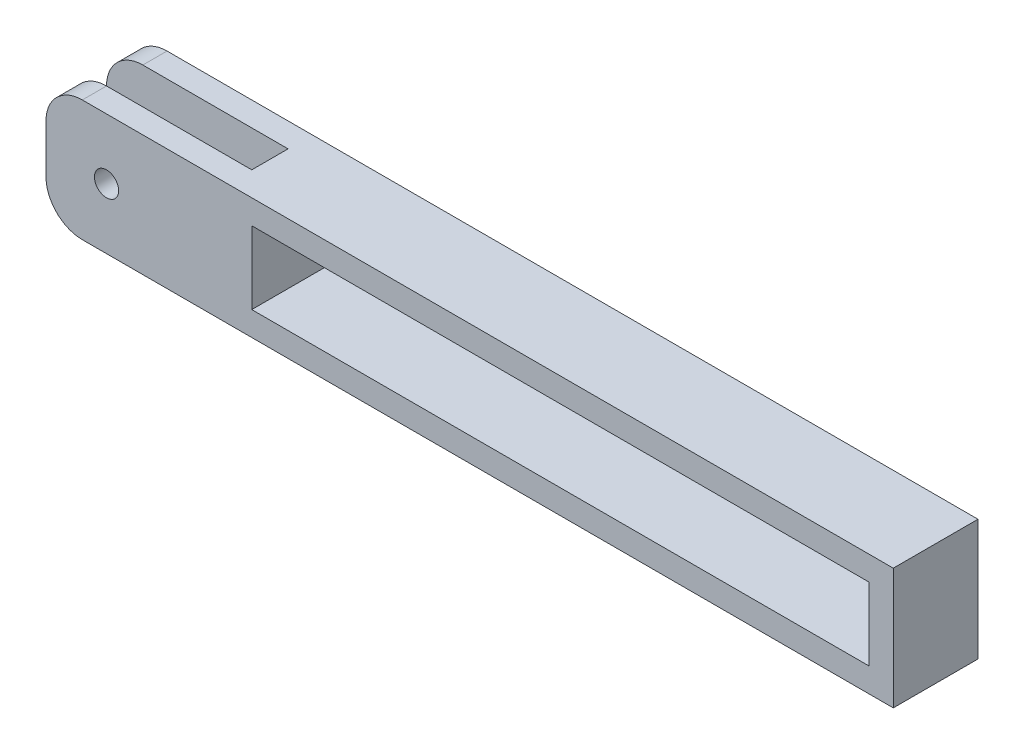
ISO-10303-21;
HEADER;
FILE_DESCRIPTION(('STEP AP214'),'2;1');
FILE_NAME('part.step','',(''),(''),'','','');
FILE_SCHEMA(('AUTOMOTIVE_DESIGN { 1 0 10303 214 1 1 1 1 }'));
ENDSEC;
DATA;
#1=APPLICATION_CONTEXT('core data for automotive mechanical design processes');
#2=APPLICATION_PROTOCOL_DEFINITION('international standard','automotive_design',2000,#1);
#3=PRODUCT_CONTEXT('',#1,'mechanical');
#4=PRODUCT('Part','Part','',(#3));
#5=PRODUCT_RELATED_PRODUCT_CATEGORY('part','',(#4));
#6=PRODUCT_DEFINITION_FORMATION('','',#4);
#7=PRODUCT_DEFINITION_CONTEXT('part definition',#1,'design');
#8=PRODUCT_DEFINITION('design','',#6,#7);
#9=PRODUCT_DEFINITION_SHAPE('','',#8);
#10=(LENGTH_UNIT() NAMED_UNIT(*) SI_UNIT(.MILLI.,.METRE.));
#11=(NAMED_UNIT(*) PLANE_ANGLE_UNIT() SI_UNIT($,.RADIAN.));
#12=(NAMED_UNIT(*) SI_UNIT($,.STERADIAN.) SOLID_ANGLE_UNIT());
#13=UNCERTAINTY_MEASURE_WITH_UNIT(LENGTH_MEASURE(1.E-05),#10,'distance_accuracy_value','');
#14=(GEOMETRIC_REPRESENTATION_CONTEXT(3) GLOBAL_UNCERTAINTY_ASSIGNED_CONTEXT((#13)) GLOBAL_UNIT_ASSIGNED_CONTEXT((#10,
#11,#12)) REPRESENTATION_CONTEXT('',''));
#15=CARTESIAN_POINT('',(0.,0.,0.));
#16=DIRECTION('',(0.,0.,1.));
#17=DIRECTION('',(1.,0.,0.));
#18=AXIS2_PLACEMENT_3D('',#15,#16,#17);
#19=CARTESIAN_POINT('',(-10.,10.,17.5));
#20=DIRECTION('',(0.,0.,-1.));
#21=DIRECTION('',(-1.,0.,0.));
#22=AXIS2_PLACEMENT_3D('',#19,#20,#21);
#23=CYLINDRICAL_SURFACE('',#22,15.);
#24=DIRECTION('',(0.,0.,-1.));
#25=VECTOR('',#24,1.);
#26=CARTESIAN_POINT('',(-25.,10.,17.5));
#27=LINE('',#26,#25);
#28=CARTESIAN_POINT('',(-25.,10.,-7.5));
#29=VERTEX_POINT('',#28);
#30=CARTESIAN_POINT('',(-25.,10.,-17.5));
#31=VERTEX_POINT('',#30);
#32=EDGE_CURVE('E268',#29,#31,#27,.T.);
#33=ORIENTED_EDGE('',*,*,#32,.F.);
#34=CARTESIAN_POINT('',(-10.,10.,-7.5));
#35=DIRECTION('',(0.,0.,-1.));
#36=DIRECTION('',(-1.,0.,0.));
#37=AXIS2_PLACEMENT_3D('',#34,#35,#36);
#38=CIRCLE('',#37,15.);
#39=CARTESIAN_POINT('',(-10.,25.,-7.5));
#40=VERTEX_POINT('',#39);
#41=EDGE_CURVE('E224',#29,#40,#38,.T.);
#42=ORIENTED_EDGE('',*,*,#41,.T.);
#43=DIRECTION('',(0.,0.,-1.));
#44=VECTOR('',#43,1.);
#45=CARTESIAN_POINT('',(-10.,25.,17.5));
#46=LINE('',#45,#44);
#47=CARTESIAN_POINT('',(-10.,25.,-17.5));
#48=VERTEX_POINT('',#47);
#49=EDGE_CURVE('E272',#40,#48,#46,.T.);
#50=ORIENTED_EDGE('',*,*,#49,.T.);
#51=CARTESIAN_POINT('',(-10.,10.,-17.5));
#52=DIRECTION('',(0.,0.,1.));
#53=DIRECTION('',(1.,0.,0.));
#54=AXIS2_PLACEMENT_3D('',#51,#52,#53);
#55=CIRCLE('',#54,15.);
#56=EDGE_CURVE('E248',#48,#31,#55,.T.);
#57=ORIENTED_EDGE('',*,*,#56,.T.);
#58=EDGE_LOOP('',(#33,#42,#50,#57));
#59=FACE_BOUND('',#58,.T.);
#60=ADVANCED_FACE('F33',(#59),#23,.T.);
#61=CARTESIAN_POINT('',(-25.,10.,17.5));
#62=DIRECTION('',(1.,0.,0.));
#63=DIRECTION('',(0.,1.,0.));
#64=AXIS2_PLACEMENT_3D('',#61,#62,#63);
#65=PLANE('',#64);
#66=DIRECTION('',(0.,0.,-1.));
#67=VECTOR('',#66,1.);
#68=CARTESIAN_POINT('',(-25.,-10.,17.5));
#69=LINE('',#68,#67);
#70=CARTESIAN_POINT('',(-25.,-10.,-7.5));
#71=VERTEX_POINT('',#70);
#72=CARTESIAN_POINT('',(-25.,-10.,-17.5));
#73=VERTEX_POINT('',#72);
#74=EDGE_CURVE('E264',#71,#73,#69,.T.);
#75=ORIENTED_EDGE('',*,*,#74,.F.);
#76=DIRECTION('',(0.,1.,0.));
#77=VECTOR('',#76,1.);
#78=CARTESIAN_POINT('',(-25.,-25.,-7.5));
#79=LINE('',#78,#77);
#80=EDGE_CURVE('E206',#71,#29,#79,.T.);
#81=ORIENTED_EDGE('',*,*,#80,.T.);
#82=ORIENTED_EDGE('',*,*,#32,.T.);
#83=DIRECTION('',(0.,-1.,0.));
#84=VECTOR('',#83,1.);
#85=CARTESIAN_POINT('',(-25.,10.,-17.5));
#86=LINE('',#85,#84);
#87=EDGE_CURVE('E251',#31,#73,#86,.T.);
#88=ORIENTED_EDGE('',*,*,#87,.T.);
#89=EDGE_LOOP('',(#75,#81,#82,#88));
#90=FACE_BOUND('',#89,.T.);
#91=ADVANCED_FACE('F327',(#90),#65,.F.);
#92=CARTESIAN_POINT('',(-10.,-10.,17.5));
#93=DIRECTION('',(0.,0.,-1.));
#94=DIRECTION('',(-1.,0.,0.));
#95=AXIS2_PLACEMENT_3D('',#92,#93,#94);
#96=CYLINDRICAL_SURFACE('',#95,15.);
#97=DIRECTION('',(0.,0.,-1.));
#98=VECTOR('',#97,1.);
#99=CARTESIAN_POINT('',(-10.,-25.,17.5));
#100=LINE('',#99,#98);
#101=CARTESIAN_POINT('',(-10.,-25.,-7.5));
#102=VERTEX_POINT('',#101);
#103=CARTESIAN_POINT('',(-10.,-25.,-17.5));
#104=VERTEX_POINT('',#103);
#105=EDGE_CURVE('E260',#102,#104,#100,.T.);
#106=ORIENTED_EDGE('',*,*,#105,.F.);
#107=CARTESIAN_POINT('',(-10.,-10.,-7.5));
#108=DIRECTION('',(0.,0.,-1.));
#109=DIRECTION('',(-1.,0.,0.));
#110=AXIS2_PLACEMENT_3D('',#107,#108,#109);
#111=CIRCLE('',#110,15.);
#112=EDGE_CURVE('E221',#102,#71,#111,.T.);
#113=ORIENTED_EDGE('',*,*,#112,.T.);
#114=ORIENTED_EDGE('',*,*,#74,.T.);
#115=CARTESIAN_POINT('',(-10.,-10.,-17.5));
#116=DIRECTION('',(0.,0.,1.));
#117=DIRECTION('',(-1.,0.,0.));
#118=AXIS2_PLACEMENT_3D('',#115,#116,#117);
#119=CIRCLE('',#118,15.);
#120=EDGE_CURVE('E254',#73,#104,#119,.T.);
#121=ORIENTED_EDGE('',*,*,#120,.T.);
#122=EDGE_LOOP('',(#106,#113,#114,#121));
#123=FACE_BOUND('',#122,.T.);
#124=ADVANCED_FACE('F324',(#123),#96,.T.);
#125=CARTESIAN_POINT('',(325.,25.,17.5));
#126=DIRECTION('',(-1.,0.,0.));
#127=DIRECTION('',(0.,0.,1.));
#128=AXIS2_PLACEMENT_3D('',#125,#126,#127);
#129=PLANE('',#128);
#130=DIRECTION('',(0.,1.,0.));
#131=VECTOR('',#130,1.);
#132=CARTESIAN_POINT('',(325.,25.,-17.5));
#133=LINE('',#132,#131);
#134=CARTESIAN_POINT('',(325.,-25.,-17.5));
#135=VERTEX_POINT('',#134);
#136=CARTESIAN_POINT('',(325.,25.,-17.5));
#137=VERTEX_POINT('',#136);
#138=EDGE_CURVE('E227',#135,#137,#133,.T.);
#139=ORIENTED_EDGE('',*,*,#138,.T.);
#140=DIRECTION('',(0.,0.,-1.));
#141=VECTOR('',#140,1.);
#142=CARTESIAN_POINT('',(325.,25.,17.5));
#143=LINE('',#142,#141);
#144=CARTESIAN_POINT('',(325.,25.,17.5));
#145=VERTEX_POINT('',#144);
#146=EDGE_CURVE('E42',#145,#137,#143,.T.);
#147=ORIENTED_EDGE('',*,*,#146,.F.);
#148=DIRECTION('',(0.,1.,0.));
#149=VECTOR('',#148,1.);
#150=CARTESIAN_POINT('',(325.,25.,17.5));
#151=LINE('',#150,#149);
#152=CARTESIAN_POINT('',(325.,-25.,17.5));
#153=VERTEX_POINT('',#152);
#154=EDGE_CURVE('E228',#153,#145,#151,.T.);
#155=ORIENTED_EDGE('',*,*,#154,.F.);
#156=DIRECTION('',(0.,0.,-1.));
#157=VECTOR('',#156,1.);
#158=CARTESIAN_POINT('',(325.,-25.,17.5));
#159=LINE('',#158,#157);
#160=EDGE_CURVE('E242',#153,#135,#159,.T.);
#161=ORIENTED_EDGE('',*,*,#160,.T.);
#162=EDGE_LOOP('',(#139,#147,#155,#161));
#163=FACE_BOUND('',#162,.T.);
#164=ADVANCED_FACE('F35',(#163),#129,.F.);
#165=CARTESIAN_POINT('',(-10.,25.,17.5));
#166=DIRECTION('',(0.,-1.,0.));
#167=DIRECTION('',(1.,0.,0.));
#168=AXIS2_PLACEMENT_3D('',#165,#166,#167);
#169=PLANE('',#168);
#170=ORIENTED_EDGE('',*,*,#49,.F.);
#171=DIRECTION('',(-1.,0.,0.));
#172=VECTOR('',#171,1.);
#173=CARTESIAN_POINT('',(-25.,25.,-7.5));
#174=LINE('',#173,#172);
#175=CARTESIAN_POINT('',(50.,25.,-7.49999999999999));
#176=VERTEX_POINT('',#175);
#177=EDGE_CURVE('E197',#176,#40,#174,.T.);
#178=ORIENTED_EDGE('',*,*,#177,.F.);
#179=DIRECTION('',(0.,0.,-1.));
#180=VECTOR('',#179,1.);
#181=CARTESIAN_POINT('',(50.,25.,-7.49999999999999));
#182=LINE('',#181,#180);
#183=CARTESIAN_POINT('',(50.,25.,7.49999999999999));
#184=VERTEX_POINT('',#183);
#185=EDGE_CURVE('E202',#184,#176,#182,.T.);
#186=ORIENTED_EDGE('',*,*,#185,.F.);
#187=DIRECTION('',(1.,0.,0.));
#188=VECTOR('',#187,1.);
#189=CARTESIAN_POINT('',(-25.,25.,7.5));
#190=LINE('',#189,#188);
#191=CARTESIAN_POINT('',(-10.,25.,7.5));
#192=VERTEX_POINT('',#191);
#193=EDGE_CURVE('E192',#192,#184,#190,.T.);
#194=ORIENTED_EDGE('',*,*,#193,.F.);
#195=CARTESIAN_POINT('',(-10.,25.,17.5));
#196=VERTEX_POINT('',#195);
#197=EDGE_CURVE('E273',#196,#192,#46,.T.);
#198=ORIENTED_EDGE('',*,*,#197,.F.);
#199=DIRECTION('',(-1.,0.,0.));
#200=VECTOR('',#199,1.);
#201=CARTESIAN_POINT('',(-10.,25.,17.5));
#202=LINE('',#201,#200);
#203=EDGE_CURVE('E231',#145,#196,#202,.T.);
#204=ORIENTED_EDGE('',*,*,#203,.F.);
#205=ORIENTED_EDGE('',*,*,#146,.T.);
#206=DIRECTION('',(-1.,0.,0.));
#207=VECTOR('',#206,1.);
#208=CARTESIAN_POINT('',(-10.,25.,-17.5));
#209=LINE('',#208,#207);
#210=EDGE_CURVE('E245',#137,#48,#209,.T.);
#211=ORIENTED_EDGE('',*,*,#210,.T.);
#212=EDGE_LOOP('',(#170,#178,#186,#194,#198,#204,#205,#211));
#213=FACE_BOUND('',#212,.T.);
#214=ADVANCED_FACE('F280',(#213),#169,.F.);
#215=ORIENTED_EDGE('',*,*,#197,.T.);
#216=CARTESIAN_POINT('',(-10.,10.,7.5));
#217=DIRECTION('',(0.,0.,1.));
#218=DIRECTION('',(1.,0.,0.));
#219=AXIS2_PLACEMENT_3D('',#216,#217,#218);
#220=CIRCLE('',#219,15.);
#221=CARTESIAN_POINT('',(-25.,10.,7.5));
#222=VERTEX_POINT('',#221);
#223=EDGE_CURVE('E218',#192,#222,#220,.T.);
#224=ORIENTED_EDGE('',*,*,#223,.T.);
#225=CARTESIAN_POINT('',(-25.,10.,17.5));
#226=VERTEX_POINT('',#225);
#227=EDGE_CURVE('E269',#226,#222,#27,.T.);
#228=ORIENTED_EDGE('',*,*,#227,.F.);
#229=CARTESIAN_POINT('',(-10.,10.,17.5));
#230=DIRECTION('',(0.,0.,1.));
#231=DIRECTION('',(1.,0.,0.));
#232=AXIS2_PLACEMENT_3D('',#229,#230,#231);
#233=CIRCLE('',#232,15.);
#234=EDGE_CURVE('E234',#196,#226,#233,.T.);
#235=ORIENTED_EDGE('',*,*,#234,.F.);
#236=EDGE_LOOP('',(#215,#224,#228,#235));
#237=FACE_BOUND('',#236,.T.);
#238=ADVANCED_FACE('F320',(#237),#23,.T.);
#239=ORIENTED_EDGE('',*,*,#227,.T.);
#240=DIRECTION('',(0.,1.,0.));
#241=VECTOR('',#240,1.);
#242=CARTESIAN_POINT('',(-25.,-25.,7.5));
#243=LINE('',#242,#241);
#244=CARTESIAN_POINT('',(-25.,-10.,7.5));
#245=VERTEX_POINT('',#244);
#246=EDGE_CURVE('E200',#245,#222,#243,.T.);
#247=ORIENTED_EDGE('',*,*,#246,.F.);
#248=CARTESIAN_POINT('',(-25.,-10.,17.5));
#249=VERTEX_POINT('',#248);
#250=EDGE_CURVE('E265',#249,#245,#69,.T.);
#251=ORIENTED_EDGE('',*,*,#250,.F.);
#252=DIRECTION('',(0.,-1.,0.));
#253=VECTOR('',#252,1.);
#254=CARTESIAN_POINT('',(-25.,10.,17.5));
#255=LINE('',#254,#253);
#256=EDGE_CURVE('E236',#226,#249,#255,.T.);
#257=ORIENTED_EDGE('',*,*,#256,.F.);
#258=EDGE_LOOP('',(#239,#247,#251,#257));
#259=FACE_BOUND('',#258,.T.);
#260=ADVANCED_FACE('F315',(#259),#65,.F.);
#261=ORIENTED_EDGE('',*,*,#250,.T.);
#262=CARTESIAN_POINT('',(-10.,-10.,7.5));
#263=DIRECTION('',(0.,0.,1.));
#264=DIRECTION('',(1.,0.,0.));
#265=AXIS2_PLACEMENT_3D('',#262,#263,#264);
#266=CIRCLE('',#265,15.);
#267=CARTESIAN_POINT('',(-10.,-25.,7.5));
#268=VERTEX_POINT('',#267);
#269=EDGE_CURVE('E209',#245,#268,#266,.T.);
#270=ORIENTED_EDGE('',*,*,#269,.T.);
#271=CARTESIAN_POINT('',(-10.,-25.,17.5));
#272=VERTEX_POINT('',#271);
#273=EDGE_CURVE('E261',#272,#268,#100,.T.);
#274=ORIENTED_EDGE('',*,*,#273,.F.);
#275=CARTESIAN_POINT('',(-10.,-10.,17.5));
#276=DIRECTION('',(0.,0.,1.));
#277=DIRECTION('',(-1.,0.,0.));
#278=AXIS2_PLACEMENT_3D('',#275,#276,#277);
#279=CIRCLE('',#278,15.);
#280=EDGE_CURVE('E238',#249,#272,#279,.T.);
#281=ORIENTED_EDGE('',*,*,#280,.F.);
#282=EDGE_LOOP('',(#261,#270,#274,#281));
#283=FACE_BOUND('',#282,.T.);
#284=ADVANCED_FACE('F311',(#283),#96,.T.);
#285=CARTESIAN_POINT('',(-10.,-25.,17.5));
#286=DIRECTION('',(0.,1.,0.));
#287=DIRECTION('',(-1.,0.,0.));
#288=AXIS2_PLACEMENT_3D('',#285,#286,#287);
#289=PLANE('',#288);
#290=DIRECTION('',(0.,0.,-1.));
#291=VECTOR('',#290,1.);
#292=CARTESIAN_POINT('',(50.,-25.,-7.49999999999999));
#293=LINE('',#292,#291);
#294=CARTESIAN_POINT('',(50.,-25.,7.49999999999999));
#295=VERTEX_POINT('',#294);
#296=CARTESIAN_POINT('',(50.,-25.,-7.49999999999999));
#297=VERTEX_POINT('',#296);
#298=EDGE_CURVE('E193',#295,#297,#293,.T.);
#299=ORIENTED_EDGE('',*,*,#298,.T.);
#300=DIRECTION('',(-1.,0.,0.));
#301=VECTOR('',#300,1.);
#302=CARTESIAN_POINT('',(-25.,-25.,-7.5));
#303=LINE('',#302,#301);
#304=EDGE_CURVE('E196',#297,#102,#303,.T.);
#305=ORIENTED_EDGE('',*,*,#304,.T.);
#306=ORIENTED_EDGE('',*,*,#105,.T.);
#307=DIRECTION('',(1.,0.,0.));
#308=VECTOR('',#307,1.);
#309=CARTESIAN_POINT('',(-10.,-25.,-17.5));
#310=LINE('',#309,#308);
#311=EDGE_CURVE('E232',#104,#135,#310,.T.);
#312=ORIENTED_EDGE('',*,*,#311,.T.);
#313=ORIENTED_EDGE('',*,*,#160,.F.);
#314=DIRECTION('',(1.,0.,0.));
#315=VECTOR('',#314,1.);
#316=CARTESIAN_POINT('',(-10.,-25.,17.5));
#317=LINE('',#316,#315);
#318=EDGE_CURVE('E240',#272,#153,#317,.T.);
#319=ORIENTED_EDGE('',*,*,#318,.F.);
#320=ORIENTED_EDGE('',*,*,#273,.T.);
#321=DIRECTION('',(1.,0.,0.));
#322=VECTOR('',#321,1.);
#323=CARTESIAN_POINT('',(-10.,-25.,7.5));
#324=LINE('',#323,#322);
#325=EDGE_CURVE('E12',#268,#295,#324,.T.);
#326=ORIENTED_EDGE('',*,*,#325,.T.);
#327=EDGE_LOOP('',(#299,#305,#306,#312,#313,#319,#320,#326));
#328=FACE_BOUND('',#327,.T.);
#329=ADVANCED_FACE('F306',(#328),#289,.F.);
#330=CARTESIAN_POINT('',(-10.,-10.,17.5));
#331=DIRECTION('',(0.,0.,-1.));
#332=DIRECTION('',(-1.,0.,0.));
#333=AXIS2_PLACEMENT_3D('',#330,#331,#332);
#334=PLANE('',#333);
#335=DIRECTION('',(0.,-1.,0.));
#336=VECTOR('',#335,1.);
#337=CARTESIAN_POINT('',(60.,-15.,17.5));
#338=LINE('',#337,#336);
#339=CARTESIAN_POINT('',(60.,15.,17.5));
#340=VERTEX_POINT('',#339);
#341=CARTESIAN_POINT('',(60.,-15.,17.5));
#342=VERTEX_POINT('',#341);
#343=EDGE_CURVE('E158',#340,#342,#338,.T.);
#344=ORIENTED_EDGE('',*,*,#343,.F.);
#345=DIRECTION('',(-1.,0.,0.));
#346=VECTOR('',#345,1.);
#347=CARTESIAN_POINT('',(315.,15.,17.5));
#348=LINE('',#347,#346);
#349=CARTESIAN_POINT('',(315.,15.,17.5));
#350=VERTEX_POINT('',#349);
#351=EDGE_CURVE('E49',#350,#340,#348,.T.);
#352=ORIENTED_EDGE('',*,*,#351,.F.);
#353=DIRECTION('',(0.,1.,0.));
#354=VECTOR('',#353,1.);
#355=CARTESIAN_POINT('',(315.,-15.,17.5));
#356=LINE('',#355,#354);
#357=CARTESIAN_POINT('',(315.,-15.,17.5));
#358=VERTEX_POINT('',#357);
#359=EDGE_CURVE('E165',#358,#350,#356,.T.);
#360=ORIENTED_EDGE('',*,*,#359,.F.);
#361=DIRECTION('',(1.,0.,0.));
#362=VECTOR('',#361,1.);
#363=CARTESIAN_POINT('',(60.,-15.,17.5));
#364=LINE('',#363,#362);
#365=EDGE_CURVE('E149',#342,#358,#364,.T.);
#366=ORIENTED_EDGE('',*,*,#365,.F.);
#367=EDGE_LOOP('',(#344,#352,#360,#366));
#368=FACE_BOUND('',#367,.T.);
#369=CARTESIAN_POINT('',(0.,0.,17.5));
#370=DIRECTION('',(0.,0.,1.));
#371=DIRECTION('',(1.,0.,0.));
#372=AXIS2_PLACEMENT_3D('',#369,#370,#371);
#373=CIRCLE('',#372,5.);
#374=CARTESIAN_POINT('',(5.,0.,17.5));
#375=VERTEX_POINT('',#374);
#376=EDGE_CURVE('E181',#375,#375,#373,.T.);
#377=ORIENTED_EDGE('',*,*,#376,.F.);
#378=EDGE_LOOP('',(#377));
#379=FACE_BOUND('',#378,.T.);
#380=ORIENTED_EDGE('',*,*,#154,.T.);
#381=ORIENTED_EDGE('',*,*,#203,.T.);
#382=ORIENTED_EDGE('',*,*,#234,.T.);
#383=ORIENTED_EDGE('',*,*,#256,.T.);
#384=ORIENTED_EDGE('',*,*,#280,.T.);
#385=ORIENTED_EDGE('',*,*,#318,.T.);
#386=EDGE_LOOP('',(#380,#381,#382,#383,#384,#385));
#387=FACE_BOUND('',#386,.T.);
#388=ADVANCED_FACE('F162',(#368,#379,#387),#334,.F.);
#389=CARTESIAN_POINT('',(-10.,-10.,-17.5));
#390=DIRECTION('',(0.,0.,-1.));
#391=DIRECTION('',(-1.,0.,0.));
#392=AXIS2_PLACEMENT_3D('',#389,#390,#391);
#393=PLANE('',#392);
#394=DIRECTION('',(-1.,0.,0.));
#395=VECTOR('',#394,1.);
#396=CARTESIAN_POINT('',(315.,15.,-17.5));
#397=LINE('',#396,#395);
#398=CARTESIAN_POINT('',(315.,15.,-17.5));
#399=VERTEX_POINT('',#398);
#400=CARTESIAN_POINT('',(60.,15.,-17.5));
#401=VERTEX_POINT('',#400);
#402=EDGE_CURVE('E167',#399,#401,#397,.T.);
#403=ORIENTED_EDGE('',*,*,#402,.T.);
#404=DIRECTION('',(0.,-1.,0.));
#405=VECTOR('',#404,1.);
#406=CARTESIAN_POINT('',(60.,-15.,-17.5));
#407=LINE('',#406,#405);
#408=CARTESIAN_POINT('',(60.,-15.,-17.5));
#409=VERTEX_POINT('',#408);
#410=EDGE_CURVE('E173',#401,#409,#407,.T.);
#411=ORIENTED_EDGE('',*,*,#410,.T.);
#412=DIRECTION('',(1.,0.,0.));
#413=VECTOR('',#412,1.);
#414=CARTESIAN_POINT('',(60.,-15.,-17.5));
#415=LINE('',#414,#413);
#416=CARTESIAN_POINT('',(315.,-15.,-17.5));
#417=VERTEX_POINT('',#416);
#418=EDGE_CURVE('E57',#409,#417,#415,.T.);
#419=ORIENTED_EDGE('',*,*,#418,.T.);
#420=DIRECTION('',(0.,1.,0.));
#421=VECTOR('',#420,1.);
#422=CARTESIAN_POINT('',(315.,-15.,-17.5));
#423=LINE('',#422,#421);
#424=EDGE_CURVE('E176',#417,#399,#423,.T.);
#425=ORIENTED_EDGE('',*,*,#424,.T.);
#426=EDGE_LOOP('',(#403,#411,#419,#425));
#427=FACE_BOUND('',#426,.T.);
#428=CARTESIAN_POINT('',(0.,0.,-17.5));
#429=DIRECTION('',(0.,0.,1.));
#430=DIRECTION('',(1.,0.,0.));
#431=AXIS2_PLACEMENT_3D('',#428,#429,#430);
#432=CIRCLE('',#431,5.);
#433=CARTESIAN_POINT('',(5.,0.,-17.5));
#434=VERTEX_POINT('',#433);
#435=EDGE_CURVE('E186',#434,#434,#432,.T.);
#436=ORIENTED_EDGE('',*,*,#435,.T.);
#437=EDGE_LOOP('',(#436));
#438=FACE_BOUND('',#437,.T.);
#439=ORIENTED_EDGE('',*,*,#138,.F.);
#440=ORIENTED_EDGE('',*,*,#311,.F.);
#441=ORIENTED_EDGE('',*,*,#120,.F.);
#442=ORIENTED_EDGE('',*,*,#87,.F.);
#443=ORIENTED_EDGE('',*,*,#56,.F.);
#444=ORIENTED_EDGE('',*,*,#210,.F.);
#445=EDGE_LOOP('',(#439,#440,#441,#442,#443,#444));
#446=FACE_BOUND('',#445,.T.);
#447=ADVANCED_FACE('F289',(#427,#438,#446),#393,.T.);
#448=CARTESIAN_POINT('',(-25.,-25.,-7.5));
#449=DIRECTION('',(0.,0.,-1.));
#450=DIRECTION('',(-1.,0.,0.));
#451=AXIS2_PLACEMENT_3D('',#448,#449,#450);
#452=PLANE('',#451);
#453=CARTESIAN_POINT('',(0.,0.,-7.5));
#454=DIRECTION('',(0.,0.,-1.));
#455=DIRECTION('',(-1.,0.,0.));
#456=AXIS2_PLACEMENT_3D('',#453,#454,#455);
#457=CIRCLE('',#456,5.);
#458=CARTESIAN_POINT('',(-5.,0.,-7.5));
#459=VERTEX_POINT('',#458);
#460=EDGE_CURVE('E189',#459,#459,#457,.T.);
#461=ORIENTED_EDGE('',*,*,#460,.T.);
#462=EDGE_LOOP('',(#461));
#463=FACE_BOUND('',#462,.T.);
#464=ORIENTED_EDGE('',*,*,#80,.F.);
#465=ORIENTED_EDGE('',*,*,#112,.F.);
#466=ORIENTED_EDGE('',*,*,#304,.F.);
#467=DIRECTION('',(0.,1.,0.));
#468=VECTOR('',#467,1.);
#469=CARTESIAN_POINT('',(50.,-25.,-7.49999999999999));
#470=LINE('',#469,#468);
#471=EDGE_CURVE('E210',#297,#176,#470,.T.);
#472=ORIENTED_EDGE('',*,*,#471,.T.);
#473=ORIENTED_EDGE('',*,*,#177,.T.);
#474=ORIENTED_EDGE('',*,*,#41,.F.);
#475=EDGE_LOOP('',(#464,#465,#466,#472,#473,#474));
#476=FACE_BOUND('',#475,.T.);
#477=ADVANCED_FACE('F298',(#463,#476),#452,.F.);
#478=CARTESIAN_POINT('',(-25.,-25.,7.5));
#479=DIRECTION('',(0.,0.,1.));
#480=DIRECTION('',(1.,0.,0.));
#481=AXIS2_PLACEMENT_3D('',#478,#479,#480);
#482=PLANE('',#481);
#483=CARTESIAN_POINT('',(0.,0.,7.5));
#484=DIRECTION('',(0.,0.,1.));
#485=DIRECTION('',(1.,0.,0.));
#486=AXIS2_PLACEMENT_3D('',#483,#484,#485);
#487=CIRCLE('',#486,5.);
#488=CARTESIAN_POINT('',(5.,0.,7.5));
#489=VERTEX_POINT('',#488);
#490=EDGE_CURVE('E37',#489,#489,#487,.T.);
#491=ORIENTED_EDGE('',*,*,#490,.T.);
#492=EDGE_LOOP('',(#491));
#493=FACE_BOUND('',#492,.T.);
#494=ORIENTED_EDGE('',*,*,#193,.T.);
#495=DIRECTION('',(0.,1.,0.));
#496=VECTOR('',#495,1.);
#497=CARTESIAN_POINT('',(50.,-25.,7.49999999999999));
#498=LINE('',#497,#496);
#499=EDGE_CURVE('E212',#295,#184,#498,.T.);
#500=ORIENTED_EDGE('',*,*,#499,.F.);
#501=ORIENTED_EDGE('',*,*,#325,.F.);
#502=ORIENTED_EDGE('',*,*,#269,.F.);
#503=ORIENTED_EDGE('',*,*,#246,.T.);
#504=ORIENTED_EDGE('',*,*,#223,.F.);
#505=EDGE_LOOP('',(#494,#500,#501,#502,#503,#504));
#506=FACE_BOUND('',#505,.T.);
#507=ADVANCED_FACE('F304',(#493,#506),#482,.F.);
#508=CARTESIAN_POINT('',(50.,-25.,-7.49999999999999));
#509=DIRECTION('',(1.,0.,0.));
#510=DIRECTION('',(0.,0.,-1.));
#511=AXIS2_PLACEMENT_3D('',#508,#509,#510);
#512=PLANE('',#511);
#513=ORIENTED_EDGE('',*,*,#185,.T.);
#514=ORIENTED_EDGE('',*,*,#471,.F.);
#515=ORIENTED_EDGE('',*,*,#298,.F.);
#516=ORIENTED_EDGE('',*,*,#499,.T.);
#517=EDGE_LOOP('',(#513,#514,#515,#516));
#518=FACE_BOUND('',#517,.T.);
#519=ADVANCED_FACE('F301',(#518),#512,.F.);
#520=CARTESIAN_POINT('',(0.,0.,-17.5));
#521=DIRECTION('',(0.,0.,1.));
#522=DIRECTION('',(1.,0.,0.));
#523=AXIS2_PLACEMENT_3D('',#520,#521,#522);
#524=CYLINDRICAL_SURFACE('',#523,5.);
#525=ORIENTED_EDGE('',*,*,#376,.T.);
#526=EDGE_LOOP('',(#525));
#527=FACE_BOUND('',#526,.T.);
#528=ORIENTED_EDGE('',*,*,#490,.F.);
#529=EDGE_LOOP('',(#528));
#530=FACE_BOUND('',#529,.T.);
#531=ADVANCED_FACE('F394',(#527,#530),#524,.F.);
#532=ORIENTED_EDGE('',*,*,#435,.F.);
#533=EDGE_LOOP('',(#532));
#534=FACE_BOUND('',#533,.T.);
#535=ORIENTED_EDGE('',*,*,#460,.F.);
#536=EDGE_LOOP('',(#535));
#537=FACE_BOUND('',#536,.T.);
#538=ADVANCED_FACE('F423',(#534,#537),#524,.F.);
#539=CARTESIAN_POINT('',(315.,15.,-17.5));
#540=DIRECTION('',(0.,1.,0.));
#541=DIRECTION('',(0.,0.,1.));
#542=AXIS2_PLACEMENT_3D('',#539,#540,#541);
#543=PLANE('',#542);
#544=DIRECTION('',(0.,0.,1.));
#545=VECTOR('',#544,1.);
#546=CARTESIAN_POINT('',(60.,15.,-17.5));
#547=LINE('',#546,#545);
#548=EDGE_CURVE('E155',#401,#340,#547,.T.);
#549=ORIENTED_EDGE('',*,*,#548,.F.);
#550=ORIENTED_EDGE('',*,*,#402,.F.);
#551=DIRECTION('',(0.,0.,1.));
#552=VECTOR('',#551,1.);
#553=CARTESIAN_POINT('',(315.,15.,-17.5));
#554=LINE('',#553,#552);
#555=EDGE_CURVE('E179',#399,#350,#554,.T.);
#556=ORIENTED_EDGE('',*,*,#555,.T.);
#557=ORIENTED_EDGE('',*,*,#351,.T.);
#558=EDGE_LOOP('',(#549,#550,#556,#557));
#559=FACE_BOUND('',#558,.T.);
#560=ADVANCED_FACE('F433',(#559),#543,.F.);
#561=CARTESIAN_POINT('',(315.,-15.,-17.5));
#562=DIRECTION('',(1.,0.,0.));
#563=DIRECTION('',(0.,0.,-1.));
#564=AXIS2_PLACEMENT_3D('',#561,#562,#563);
#565=PLANE('',#564);
#566=ORIENTED_EDGE('',*,*,#555,.F.);
#567=ORIENTED_EDGE('',*,*,#424,.F.);
#568=DIRECTION('',(0.,0.,1.));
#569=VECTOR('',#568,1.);
#570=CARTESIAN_POINT('',(315.,-15.,-17.5));
#571=LINE('',#570,#569);
#572=EDGE_CURVE('E154',#417,#358,#571,.T.);
#573=ORIENTED_EDGE('',*,*,#572,.T.);
#574=ORIENTED_EDGE('',*,*,#359,.T.);
#575=EDGE_LOOP('',(#566,#567,#573,#574));
#576=FACE_BOUND('',#575,.T.);
#577=ADVANCED_FACE('F455',(#576),#565,.F.);
#578=CARTESIAN_POINT('',(60.,-15.,-17.5));
#579=DIRECTION('',(0.,-1.,0.));
#580=DIRECTION('',(1.,0.,0.));
#581=AXIS2_PLACEMENT_3D('',#578,#579,#580);
#582=PLANE('',#581);
#583=ORIENTED_EDGE('',*,*,#572,.F.);
#584=ORIENTED_EDGE('',*,*,#418,.F.);
#585=DIRECTION('',(0.,0.,1.));
#586=VECTOR('',#585,1.);
#587=CARTESIAN_POINT('',(60.,-15.,-17.5));
#588=LINE('',#587,#586);
#589=EDGE_CURVE('E145',#409,#342,#588,.T.);
#590=ORIENTED_EDGE('',*,*,#589,.T.);
#591=ORIENTED_EDGE('',*,*,#365,.T.);
#592=EDGE_LOOP('',(#583,#584,#590,#591));
#593=FACE_BOUND('',#592,.T.);
#594=ADVANCED_FACE('F147',(#593),#582,.F.);
#595=CARTESIAN_POINT('',(60.,-15.,-17.5));
#596=DIRECTION('',(-1.,0.,0.));
#597=DIRECTION('',(0.,-1.,0.));
#598=AXIS2_PLACEMENT_3D('',#595,#596,#597);
#599=PLANE('',#598);
#600=ORIENTED_EDGE('',*,*,#589,.F.);
#601=ORIENTED_EDGE('',*,*,#410,.F.);
#602=ORIENTED_EDGE('',*,*,#548,.T.);
#603=ORIENTED_EDGE('',*,*,#343,.T.);
#604=EDGE_LOOP('',(#600,#601,#602,#603));
#605=FACE_BOUND('',#604,.T.);
#606=ADVANCED_FACE('F159',(#605),#599,.F.);
#607=CLOSED_SHELL('',(#60,#91,#124,#164,#214,#238,#260,#284,#329,#388,#447,#477,#507,#519,#531,
#538,#560,#577,#594,#606));
#608=MANIFOLD_SOLID_BREP('B2',#607);
#609=ADVANCED_BREP_SHAPE_REPRESENTATION('',(#18,#608),#14);
#610=SHAPE_DEFINITION_REPRESENTATION(#9,#609);
ENDSEC;
END-ISO-10303-21;
